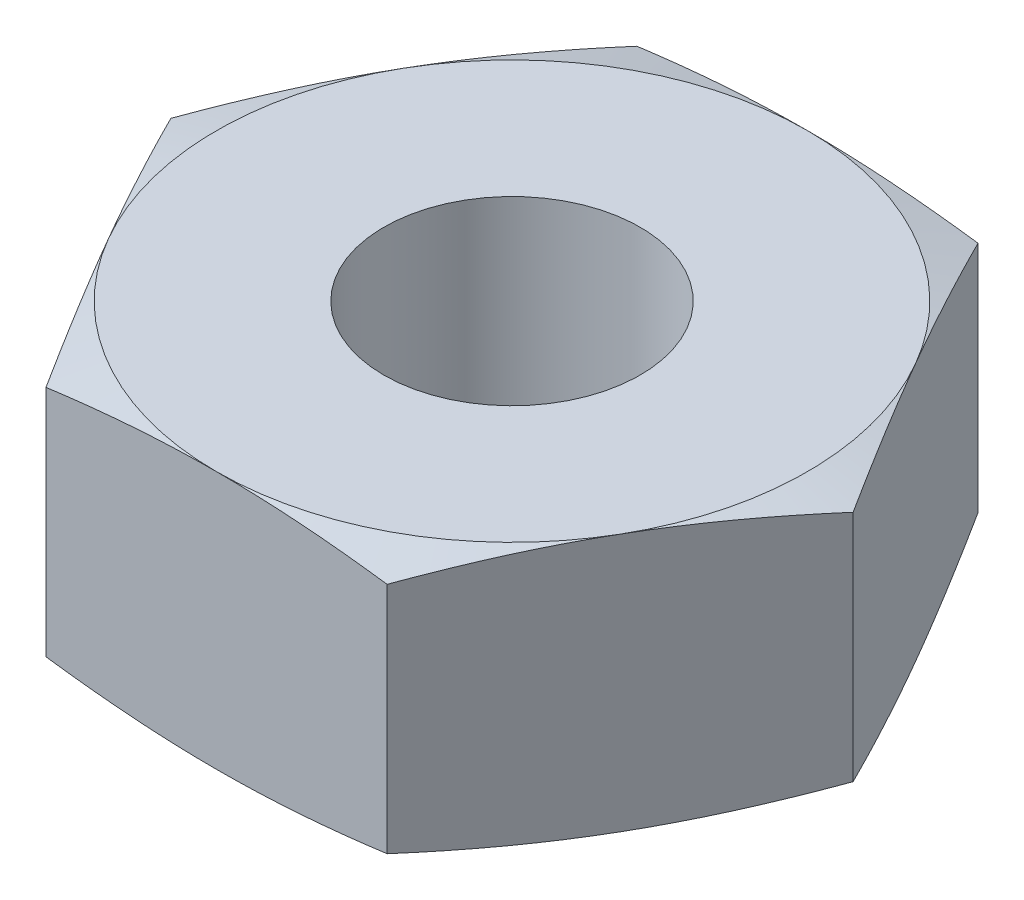
ISO-10303-21;
HEADER;
FILE_DESCRIPTION(('STEP AP214'),'2;1');
FILE_NAME('part.step','',(''),(''),'','','');
FILE_SCHEMA(('AUTOMOTIVE_DESIGN { 1 0 10303 214 1 1 1 1 }'));
ENDSEC;
DATA;
#1=APPLICATION_CONTEXT('core data for automotive mechanical design processes');
#2=APPLICATION_PROTOCOL_DEFINITION('international standard','automotive_design',2000,#1);
#3=PRODUCT_CONTEXT('',#1,'mechanical');
#4=PRODUCT('Part','Part','',(#3));
#5=PRODUCT_RELATED_PRODUCT_CATEGORY('part','',(#4));
#6=PRODUCT_DEFINITION_FORMATION('','',#4);
#7=PRODUCT_DEFINITION_CONTEXT('part definition',#1,'design');
#8=PRODUCT_DEFINITION('design','',#6,#7);
#9=PRODUCT_DEFINITION_SHAPE('','',#8);
#10=(LENGTH_UNIT() NAMED_UNIT(*) SI_UNIT(.MILLI.,.METRE.));
#11=(NAMED_UNIT(*) PLANE_ANGLE_UNIT() SI_UNIT($,.RADIAN.));
#12=(NAMED_UNIT(*) SI_UNIT($,.STERADIAN.) SOLID_ANGLE_UNIT());
#13=UNCERTAINTY_MEASURE_WITH_UNIT(LENGTH_MEASURE(1.E-05),#10,'distance_accuracy_value','');
#14=(GEOMETRIC_REPRESENTATION_CONTEXT(3) GLOBAL_UNCERTAINTY_ASSIGNED_CONTEXT((#13)) GLOBAL_UNIT_ASSIGNED_CONTEXT((#10,
#11,#12)) REPRESENTATION_CONTEXT('',''));
#15=CARTESIAN_POINT('',(0.,0.,0.));
#16=DIRECTION('',(0.,0.,1.));
#17=DIRECTION('',(1.,0.,0.));
#18=AXIS2_PLACEMENT_3D('',#15,#16,#17);
#19=CARTESIAN_POINT('',(1.58771324027147,1.2,2.75));
#20=DIRECTION('',(-0.866025403784439,0.,-0.5));
#21=DIRECTION('',(-0.5,0.,0.866025403784439));
#22=AXIS2_PLACEMENT_3D('',#19,#20,#21);
#23=PLANE('',#22);
#24=CARTESIAN_POINT('',(3.17554195059678,-1.08597637630444,-0.000200000000000029));
#25=CARTESIAN_POINT('',(3.10959865092347,-1.10365443906504,0.114017145452912));
#26=CARTESIAN_POINT('',(3.04353577722558,-1.11970328837943,0.228441399191655));
#27=CARTESIAN_POINT('',(2.91117669093731,-1.14789971485019,0.457694061486332));
#28=CARTESIAN_POINT('',(2.84488039456776,-1.1600457069014,0.572522615152036));
#29=CARTESIAN_POINT('',(2.71245647646233,-1.1797272517536,0.801887569447985));
#30=CARTESIAN_POINT('',(2.6463297504511,-1.18728627891702,0.916422418637631));
#31=CARTESIAN_POINT('',(2.51399195722482,-1.19742217092489,1.14563820026708));
#32=CARTESIAN_POINT('',(2.44778090881601,-1.19999999999999,1.26031910013354));
#33=CARTESIAN_POINT('',(2.3153588119984,-1.19999999999999,1.48968089986646));
#34=CARTESIAN_POINT('',(2.24914776358959,-1.19742217092489,1.60436179973292));
#35=CARTESIAN_POINT('',(2.11680997036331,-1.18728627891702,1.83357758136237));
#36=CARTESIAN_POINT('',(2.05068324435208,-1.1797272517536,1.94811243055202));
#37=CARTESIAN_POINT('',(1.91825932624665,-1.1600457069014,2.17747738484797));
#38=CARTESIAN_POINT('',(1.8519630298771,-1.14789971485019,2.29230593851367));
#39=CARTESIAN_POINT('',(1.71960394358883,-1.11970328837943,2.52155860080835));
#40=CARTESIAN_POINT('',(1.65354106989094,-1.10365443906503,2.63598285454709));
#41=CARTESIAN_POINT('',(1.58759777021763,-1.08597637630444,2.7502));
#42=B_SPLINE_CURVE_WITH_KNOTS('',3,(#24,#25,#26,#27,#28,#29,#30,#31,#32,#33,#34,#35,#36,#37,#38,
#39,#40,#41),.UNSPECIFIED.,.F.,.F.,(4,2,2,2,2,2,2,2,4),(0.,0.399219246203696,0.798600426844827,
1.19592009799431,1.59316285066086,1.99040560332741,2.38772527447689,2.78710645511802,
3.18632570132172),.UNSPECIFIED.);
#43=CARTESIAN_POINT('',(3.17542648054295,-1.0860073180997,0.));
#44=VERTEX_POINT('',#43);
#45=CARTESIAN_POINT('',(2.38156986040721,-1.2,1.375));
#46=VERTEX_POINT('',#45);
#47=EDGE_CURVE('E54',#44,#46,#42,.T.);
#48=ORIENTED_EDGE('',*,*,#47,.F.);
#49=DIRECTION('',(0.,-1.,0.));
#50=VECTOR('',#49,1.);
#51=CARTESIAN_POINT('',(3.17542648054294,1.2,0.));
#52=LINE('',#51,#50);
#53=CARTESIAN_POINT('',(3.17542648054295,1.0860073180997,0.));
#54=VERTEX_POINT('',#53);
#55=EDGE_CURVE('E172',#54,#44,#52,.T.);
#56=ORIENTED_EDGE('',*,*,#55,.F.);
#57=CARTESIAN_POINT('',(1.58759777021763,1.08597637630445,2.7502));
#58=CARTESIAN_POINT('',(1.65354106989094,1.10365443906503,2.63598285454709));
#59=CARTESIAN_POINT('',(1.71960394358883,1.11970328837943,2.52155860080835));
#60=CARTESIAN_POINT('',(1.8519630298771,1.14789971485019,2.29230593851367));
#61=CARTESIAN_POINT('',(1.91825932624665,1.1600457069014,2.17747738484796));
#62=CARTESIAN_POINT('',(2.05068324435208,1.1797272517536,1.94811243055202));
#63=CARTESIAN_POINT('',(2.11680997036331,1.18728627891702,1.83357758136237));
#64=CARTESIAN_POINT('',(2.24914776358959,1.19742217092489,1.60436179973292));
#65=CARTESIAN_POINT('',(2.3153588119984,1.19999999999999,1.48968089986646));
#66=CARTESIAN_POINT('',(2.44778090881601,1.19999999999999,1.26031910013354));
#67=CARTESIAN_POINT('',(2.51399195722482,1.19742217092489,1.14563820026708));
#68=CARTESIAN_POINT('',(2.6463297504511,1.18728627891702,0.91642241863763));
#69=CARTESIAN_POINT('',(2.71245647646233,1.1797272517536,0.801887569447984));
#70=CARTESIAN_POINT('',(2.84488039456776,1.1600457069014,0.572522615152035));
#71=CARTESIAN_POINT('',(2.91117669093731,1.14789971485019,0.457694061486332));
#72=CARTESIAN_POINT('',(3.04353577722558,1.11970328837943,0.228441399191655));
#73=CARTESIAN_POINT('',(3.10959865092347,1.10365443906503,0.114017145452912));
#74=CARTESIAN_POINT('',(3.17554195059678,1.08597637630444,-0.00020000000000015));
#75=B_SPLINE_CURVE_WITH_KNOTS('',3,(#57,#58,#59,#60,#61,#62,#63,#64,#65,#66,#67,#68,#69,#70,#71,
#72,#73,#74),.UNSPECIFIED.,.F.,.F.,(4,2,2,2,2,2,2,2,4),(0.,0.399219246203696,0.798600426844827,
1.19592009799431,1.59316285066086,1.99040560332741,2.38772527447689,2.78710645511802,
3.18632570132172),.UNSPECIFIED.);
#76=CARTESIAN_POINT('',(2.38156986040721,1.2,1.375));
#77=VERTEX_POINT('',#76);
#78=EDGE_CURVE('E264',#77,#54,#75,.T.);
#79=ORIENTED_EDGE('',*,*,#78,.F.);
#80=CARTESIAN_POINT('',(1.58771324027148,1.0860073180997,2.75));
#81=VERTEX_POINT('',#80);
#82=EDGE_CURVE('E162',#81,#77,#75,.T.);
#83=ORIENTED_EDGE('',*,*,#82,.F.);
#84=DIRECTION('',(0.,-1.,0.));
#85=VECTOR('',#84,1.);
#86=CARTESIAN_POINT('',(1.58771324027147,1.2,2.75));
#87=LINE('',#86,#85);
#88=CARTESIAN_POINT('',(1.58771324027148,-1.0860073180997,2.75));
#89=VERTEX_POINT('',#88);
#90=EDGE_CURVE('E157',#81,#89,#87,.T.);
#91=ORIENTED_EDGE('',*,*,#90,.T.);
#92=EDGE_CURVE('E149',#46,#89,#42,.T.);
#93=ORIENTED_EDGE('',*,*,#92,.F.);
#94=EDGE_LOOP('',(#48,#56,#79,#83,#91,#93));
#95=FACE_BOUND('',#94,.T.);
#96=ADVANCED_FACE('F38',(#95),#23,.F.);
#97=CARTESIAN_POINT('',(3.17542648054294,1.2,0.));
#98=DIRECTION('',(-0.866025403784439,0.,0.5));
#99=DIRECTION('',(0.5,0.,0.866025403784439));
#100=AXIS2_PLACEMENT_3D('',#97,#98,#99);
#101=PLANE('',#100);
#102=CARTESIAN_POINT('',(1.58759777021763,-1.08597637630445,-2.7502));
#103=CARTESIAN_POINT('',(1.65354106989094,-1.10365443906503,-2.63598285454709));
#104=CARTESIAN_POINT('',(1.71960394358883,-1.11970328837943,-2.52155860080835));
#105=CARTESIAN_POINT('',(1.8519630298771,-1.14789971485019,-2.29230593851367));
#106=CARTESIAN_POINT('',(1.91825932624665,-1.1600457069014,-2.17747738484797));
#107=CARTESIAN_POINT('',(2.05068324435208,-1.1797272517536,-1.94811243055202));
#108=CARTESIAN_POINT('',(2.11680997036331,-1.18728627891702,-1.83357758136237));
#109=CARTESIAN_POINT('',(2.24914776358959,-1.19742217092489,-1.60436179973292));
#110=CARTESIAN_POINT('',(2.3153588119984,-1.19999999999999,-1.48968089986646));
#111=CARTESIAN_POINT('',(2.44778090881601,-1.19999999999999,-1.26031910013354));
#112=CARTESIAN_POINT('',(2.51399195722482,-1.19742217092489,-1.14563820026708));
#113=CARTESIAN_POINT('',(2.6463297504511,-1.18728627891702,-0.916422418637631));
#114=CARTESIAN_POINT('',(2.71245647646233,-1.1797272517536,-0.801887569447985));
#115=CARTESIAN_POINT('',(2.84488039456776,-1.1600457069014,-0.572522615152036));
#116=CARTESIAN_POINT('',(2.91117669093731,-1.14789971485019,-0.457694061486332));
#117=CARTESIAN_POINT('',(3.04353577722558,-1.11970328837943,-0.228441399191655));
#118=CARTESIAN_POINT('',(3.10959865092347,-1.10365443906503,-0.114017145452912));
#119=CARTESIAN_POINT('',(3.17554195059678,-1.08597637630444,0.000199999999999699));
#120=B_SPLINE_CURVE_WITH_KNOTS('',3,(#102,#103,#104,#105,#106,#107,#108,#109,#110,#111,#112,
#113,#114,#115,#116,#117,#118,#119),.UNSPECIFIED.,.F.,.F.,(4,2,2,2,2,2,2,2,4),(0.,
0.399219246203696,0.798600426844827,1.19592009799431,1.59316285066086,1.99040560332741,
2.38772527447689,2.78710645511802,3.18632570132172),.UNSPECIFIED.);
#121=CARTESIAN_POINT('',(1.58771324027146,-1.0860073180997,-2.75000000000001));
#122=VERTEX_POINT('',#121);
#123=CARTESIAN_POINT('',(2.38156986040721,-1.2,-1.375));
#124=VERTEX_POINT('',#123);
#125=EDGE_CURVE('E61',#122,#124,#120,.T.);
#126=ORIENTED_EDGE('',*,*,#125,.F.);
#127=DIRECTION('',(0.,-1.,0.));
#128=VECTOR('',#127,1.);
#129=CARTESIAN_POINT('',(1.58771324027147,1.2,-2.75));
#130=LINE('',#129,#128);
#131=CARTESIAN_POINT('',(1.58771324027148,1.0860073180997,-2.75));
#132=VERTEX_POINT('',#131);
#133=EDGE_CURVE('E168',#132,#122,#130,.T.);
#134=ORIENTED_EDGE('',*,*,#133,.F.);
#135=CARTESIAN_POINT('',(3.17554195059678,1.08597637630444,0.000199999999999324));
#136=CARTESIAN_POINT('',(3.10959865092347,1.10365443906503,-0.114017145452913));
#137=CARTESIAN_POINT('',(3.04353577722558,1.11970328837943,-0.228441399191655));
#138=CARTESIAN_POINT('',(2.91117669093731,1.14789971485019,-0.457694061486333));
#139=CARTESIAN_POINT('',(2.84488039456776,1.1600457069014,-0.572522615152036));
#140=CARTESIAN_POINT('',(2.71245647646233,1.1797272517536,-0.801887569447985));
#141=CARTESIAN_POINT('',(2.6463297504511,1.18728627891702,-0.916422418637631));
#142=CARTESIAN_POINT('',(2.51399195722482,1.19742217092489,-1.14563820026708));
#143=CARTESIAN_POINT('',(2.44778090881601,1.19999999999999,-1.26031910013354));
#144=CARTESIAN_POINT('',(2.3153588119984,1.19999999999999,-1.48968089986646));
#145=CARTESIAN_POINT('',(2.24914776358959,1.19742217092489,-1.60436179973292));
#146=CARTESIAN_POINT('',(2.11680997036331,1.18728627891702,-1.83357758136237));
#147=CARTESIAN_POINT('',(2.05068324435208,1.1797272517536,-1.94811243055202));
#148=CARTESIAN_POINT('',(1.91825932624665,1.1600457069014,-2.17747738484797));
#149=CARTESIAN_POINT('',(1.8519630298771,1.14789971485019,-2.29230593851367));
#150=CARTESIAN_POINT('',(1.71960394358883,1.11970328837943,-2.52155860080835));
#151=CARTESIAN_POINT('',(1.65354106989094,1.10365443906503,-2.63598285454709));
#152=CARTESIAN_POINT('',(1.58759777021763,1.08597637630444,-2.7502));
#153=B_SPLINE_CURVE_WITH_KNOTS('',3,(#135,#136,#137,#138,#139,#140,#141,#142,#143,#144,#145,
#146,#147,#148,#149,#150,#151,#152),.UNSPECIFIED.,.F.,.F.,(4,2,2,2,2,2,2,2,4),(0.,
0.399219246203696,0.798600426844827,1.19592009799431,1.59316285066086,1.99040560332741,
2.38772527447689,2.78710645511802,3.18632570132172),.UNSPECIFIED.);
#154=CARTESIAN_POINT('',(2.38156986040721,1.2,-1.375));
#155=VERTEX_POINT('',#154);
#156=EDGE_CURVE('E258',#155,#132,#153,.T.);
#157=ORIENTED_EDGE('',*,*,#156,.F.);
#158=EDGE_CURVE('E262',#54,#155,#153,.T.);
#159=ORIENTED_EDGE('',*,*,#158,.F.);
#160=ORIENTED_EDGE('',*,*,#55,.T.);
#161=EDGE_CURVE('E276',#124,#44,#120,.T.);
#162=ORIENTED_EDGE('',*,*,#161,.F.);
#163=EDGE_LOOP('',(#126,#134,#157,#159,#160,#162));
#164=FACE_BOUND('',#163,.T.);
#165=ADVANCED_FACE('F268',(#164),#101,.F.);
#166=CARTESIAN_POINT('',(1.58771324027147,1.2,-2.75));
#167=DIRECTION('',(0.,0.,1.));
#168=DIRECTION('',(1.,0.,0.));
#169=AXIS2_PLACEMENT_3D('',#166,#167,#168);
#170=PLANE('',#169);
#171=CARTESIAN_POINT('',(-4.27636085043983,-0.574535274427041,-2.75));
#172=CARTESIAN_POINT('',(-4.15064869310771,-0.602860126130478,-2.75));
#173=CARTESIAN_POINT('',(-4.02485999707096,-0.630850457396701,-2.75));
#174=CARTESIAN_POINT('',(-3.77309163921182,-0.685982573720404,-2.75));
#175=CARTESIAN_POINT('',(-3.64711196983412,-0.713124324236215,-2.75));
#176=CARTESIAN_POINT('',(-3.39482501692458,-0.766400454095589,-2.75));
#177=CARTESIAN_POINT('',(-3.26851754434713,-0.792533942518524,-2.75));
#178=CARTESIAN_POINT('',(-3.01564537804616,-0.843518803311811,-2.75));
#179=CARTESIAN_POINT('',(-2.88908068636279,-0.868370185810373,-2.75));
#180=CARTESIAN_POINT('',(-2.51119982672915,-0.94014042557273,-2.75));
#181=CARTESIAN_POINT('',(-2.259439179107,-0.984762145313864,-2.75));
#182=CARTESIAN_POINT('',(-1.75437363109257,-1.06452753951379,-2.75));
#183=CARTESIAN_POINT('',(-1.5010688760915,-1.0996720926535,-2.75));
#184=CARTESIAN_POINT('',(-1.11844193079639,-1.14200549702533,-2.75));
#185=CARTESIAN_POINT('',(-0.989701627895131,-1.15442718932931,-2.75));
#186=CARTESIAN_POINT('',(-0.73188837604658,-1.17506258003211,-2.75));
#187=CARTESIAN_POINT('',(-0.602815456837377,-1.18327664234063,-2.75));
#188=CARTESIAN_POINT('',(-0.344521177221319,-1.19502221761625,-2.75));
#189=CARTESIAN_POINT('',(-0.215299931660418,-1.19855620864307,-2.75));
#190=CARTESIAN_POINT('',(0.0431842262815525,-1.20072236088508,-2.75));
#191=CARTESIAN_POINT('',(0.172447138542314,-1.19935453612906,-2.75));
#192=CARTESIAN_POINT('',(0.431421027849017,-1.19178940324801,-2.75));
#193=CARTESIAN_POINT('',(0.561131346311024,-1.18557000969012,-2.75));
#194=CARTESIAN_POINT('',(0.820261259095127,-1.16865782117221,-2.75));
#195=CARTESIAN_POINT('',(0.949680837577812,-1.15796478816002,-2.75));
#196=CARTESIAN_POINT('',(1.20822752304289,-1.13266422024831,-2.75));
#197=CARTESIAN_POINT('',(1.33735434228499,-1.11805379091975,-2.75));
#198=CARTESIAN_POINT('',(1.59518795631852,-1.08554986868654,-2.75));
#199=CARTESIAN_POINT('',(1.72389475301019,-1.06765639065592,-2.75));
#200=CARTESIAN_POINT('',(2.00976923057656,-1.02486366878538,-2.75));
#201=CARTESIAN_POINT('',(2.1668357454543,-0.999293599047255,-2.75));
#202=CARTESIAN_POINT('',(2.48043642831434,-0.945059945227124,-2.75));
#203=CARTESIAN_POINT('',(2.63697056495118,-0.916396182138713,-2.75));
#204=CARTESIAN_POINT('',(2.94961659006402,-0.856699157573873,-2.75));
#205=CARTESIAN_POINT('',(3.10572838580151,-0.825665413497669,-2.75));
#206=CARTESIAN_POINT('',(3.4175804322032,-0.761778633970489,-2.75));
#207=CARTESIAN_POINT('',(3.57332067537021,-0.728925562127603,-2.75));
#208=CARTESIAN_POINT('',(4.04027781605472,-0.628239216302156,-2.75));
#209=CARTESIAN_POINT('',(4.35104289966404,-0.558315887309779,-2.75));
#210=CARTESIAN_POINT('',(4.97173435648208,-0.415058253392503,-2.75));
#211=CARTESIAN_POINT('',(5.28166083184902,-0.341724385743333,-2.75));
#212=CARTESIAN_POINT('',(5.89619777668217,-0.193963061621825,-2.75));
#213=CARTESIAN_POINT('',(6.20081651406682,-0.119569914597573,-2.75));
#214=CARTESIAN_POINT('',(6.80969786964483,0.0307062456877314,-2.75));
#215=CARTESIAN_POINT('',(7.11396047331712,0.106589317600791,-2.75));
#216=CARTESIAN_POINT('',(7.72162480619849,0.25925766485698,-2.75));
#217=CARTESIAN_POINT('',(8.02502705380527,0.336040880148408,-2.75));
#218=CARTESIAN_POINT('',(8.63161623647014,0.490389456843218,-2.75));
#219=CARTESIAN_POINT('',(8.9348031816875,0.567954778296711,-2.75));
#220=CARTESIAN_POINT('',(9.23792207783451,0.645782218683325,-2.75));
#221=B_SPLINE_CURVE_WITH_KNOTS('',3,(#171,#172,#173,#174,#175,#176,#177,#178,#179,#180,#181,
#182,#183,#184,#185,#186,#187,#188,#189,#190,#191,#192,#193,#194,#195,#196,#197,#198,#199,#200,
#201,#202,#203,#204,#205,#206,#207,#208,#209,#210,#211,#212,#213,#214,#215,#216,#217,#218,#219,
#220),.UNSPECIFIED.,.F.,.F.,(4,2,2,2,2,2,2,2,2,2,2,2,2,2,2,2,2,2,2,2,2,2,2,2,4),(0.,
0.386592162363836,0.773200040614211,1.16014205468213,1.54708101156903,2.31403183337596,
3.08091152243168,3.46886888912461,3.85679269647433,4.24451101908412,4.6322282320609,
5.02172079475262,5.41123408583486,5.80103597174549,6.19083609168133,6.66819654644838,
7.14558463693252,7.62307019860843,8.10056531485361,9.05613097273136,10.0115744505277,
10.9522823572973,11.8930273702795,12.8319283500748,13.7707816114541),.UNSPECIFIED.);
#222=CARTESIAN_POINT('',(-1.58771324027146,-1.0860073180997,-2.75000000000001));
#223=VERTEX_POINT('',#222);
#224=CARTESIAN_POINT('',(0.,-1.2,-2.75));
#225=VERTEX_POINT('',#224);
#226=EDGE_CURVE('E291',#223,#225,#221,.T.);
#227=ORIENTED_EDGE('',*,*,#226,.F.);
#228=DIRECTION('',(0.,-1.,0.));
#229=VECTOR('',#228,1.);
#230=CARTESIAN_POINT('',(-1.58771324027147,1.2,-2.75));
#231=LINE('',#230,#229);
#232=CARTESIAN_POINT('',(-1.58771324027146,1.0860073180997,-2.75000000000001));
#233=VERTEX_POINT('',#232);
#234=EDGE_CURVE('E159',#233,#223,#231,.T.);
#235=ORIENTED_EDGE('',*,*,#234,.F.);
#236=CARTESIAN_POINT('',(-4.27636085043983,0.57453527442704,-2.75));
#237=CARTESIAN_POINT('',(-4.15064869310772,0.602860126130479,-2.75));
#238=CARTESIAN_POINT('',(-4.02485999707096,0.630850457396702,-2.75));
#239=CARTESIAN_POINT('',(-3.77309163921183,0.685982573720404,-2.75));
#240=CARTESIAN_POINT('',(-3.64711196983412,0.713124324236213,-2.75));
#241=CARTESIAN_POINT('',(-3.39482501692458,0.766400454095587,-2.75));
#242=CARTESIAN_POINT('',(-3.26851754434713,0.792533942518522,-2.75));
#243=CARTESIAN_POINT('',(-3.01564537804616,0.843518803311811,-2.75));
#244=CARTESIAN_POINT('',(-2.88908068636279,0.868370185810373,-2.75));
#245=CARTESIAN_POINT('',(-2.51119982672915,0.940140425572731,-2.75));
#246=CARTESIAN_POINT('',(-2.259439179107,0.984762145313865,-2.75));
#247=CARTESIAN_POINT('',(-1.75437363109257,1.06452753951379,-2.75));
#248=CARTESIAN_POINT('',(-1.5010688760915,1.0996720926535,-2.75));
#249=CARTESIAN_POINT('',(-1.11844193079639,1.14200549702532,-2.75));
#250=CARTESIAN_POINT('',(-0.989701627895131,1.15442718932931,-2.75));
#251=CARTESIAN_POINT('',(-0.73188837604658,1.17506258003211,-2.75));
#252=CARTESIAN_POINT('',(-0.602815456837377,1.18327664234063,-2.75));
#253=CARTESIAN_POINT('',(-0.344521177221319,1.19502221761625,-2.75));
#254=CARTESIAN_POINT('',(-0.215299931660418,1.19855620864308,-2.75));
#255=CARTESIAN_POINT('',(0.0431842262815522,1.20072236088509,-2.75));
#256=CARTESIAN_POINT('',(0.172447138542314,1.19935453612906,-2.75));
#257=CARTESIAN_POINT('',(0.431421027849017,1.19178940324801,-2.75));
#258=CARTESIAN_POINT('',(0.561131346311025,1.18557000969012,-2.75));
#259=CARTESIAN_POINT('',(0.820261259095127,1.16865782117221,-2.75));
#260=CARTESIAN_POINT('',(0.949680837577812,1.15796478816002,-2.75));
#261=CARTESIAN_POINT('',(1.20822752304289,1.13266422024831,-2.75));
#262=CARTESIAN_POINT('',(1.33735434228499,1.11805379091974,-2.75));
#263=CARTESIAN_POINT('',(1.59518795631852,1.08554986868654,-2.75));
#264=CARTESIAN_POINT('',(1.72389475301019,1.06765639065592,-2.75));
#265=CARTESIAN_POINT('',(2.00976923057656,1.02486366878538,-2.75));
#266=CARTESIAN_POINT('',(2.1668357454543,0.999293599047253,-2.75));
#267=CARTESIAN_POINT('',(2.48043642831434,0.945059945227124,-2.75));
#268=CARTESIAN_POINT('',(2.63697056495118,0.916396182138718,-2.75));
#269=CARTESIAN_POINT('',(2.94961659006402,0.85669915757388,-2.75));
#270=CARTESIAN_POINT('',(3.10572838580151,0.82566541349767,-2.75));
#271=CARTESIAN_POINT('',(3.4175804322032,0.761778633970488,-2.75));
#272=CARTESIAN_POINT('',(3.57332067537021,0.728925562127605,-2.75));
#273=CARTESIAN_POINT('',(4.04027781605472,0.628239216302161,-2.75));
#274=CARTESIAN_POINT('',(4.35104289966404,0.558315887309779,-2.75));
#275=CARTESIAN_POINT('',(4.97173435648208,0.415058253392501,-2.75));
#276=CARTESIAN_POINT('',(5.28166083184902,0.341724385743334,-2.75));
#277=CARTESIAN_POINT('',(5.89619777668217,0.193963061621828,-2.75));
#278=CARTESIAN_POINT('',(6.20081651406682,0.119569914597574,-2.75));
#279=CARTESIAN_POINT('',(6.80969786964483,-0.0307062456877316,-2.75));
#280=CARTESIAN_POINT('',(7.11396047331712,-0.106589317600792,-2.75));
#281=CARTESIAN_POINT('',(7.72162480619849,-0.259257664856981,-2.75));
#282=CARTESIAN_POINT('',(8.02502705380527,-0.33604088014841,-2.75));
#283=CARTESIAN_POINT('',(8.63161623647014,-0.49038945684322,-2.75));
#284=CARTESIAN_POINT('',(8.9348031816875,-0.567954778296713,-2.75));
#285=CARTESIAN_POINT('',(9.23792207783451,-0.645782218683328,-2.75));
#286=B_SPLINE_CURVE_WITH_KNOTS('',3,(#236,#237,#238,#239,#240,#241,#242,#243,#244,#245,#246,
#247,#248,#249,#250,#251,#252,#253,#254,#255,#256,#257,#258,#259,#260,#261,#262,#263,#264,#265,
#266,#267,#268,#269,#270,#271,#272,#273,#274,#275,#276,#277,#278,#279,#280,#281,#282,#283,#284,
#285),.UNSPECIFIED.,.F.,.F.,(4,2,2,2,2,2,2,2,2,2,2,2,2,2,2,2,2,2,2,2,2,2,2,2,4),(0.,
0.386592162363837,0.773200040614211,1.16014205468213,1.54708101156903,2.31403183337596,
3.08091152243168,3.46886888912461,3.85679269647433,4.24451101908412,4.6322282320609,
5.02172079475262,5.41123408583487,5.80103597174549,6.19083609168133,6.66819654644838,
7.14558463693252,7.62307019860843,8.10056531485361,9.05613097273136,10.0115744505277,
10.9522823572973,11.8930273702795,12.8319283500748,13.7707816114541),.UNSPECIFIED.);
#287=CARTESIAN_POINT('',(0.,1.2,-2.75));
#288=VERTEX_POINT('',#287);
#289=EDGE_CURVE('E215',#288,#233,#286,.F.);
#290=ORIENTED_EDGE('',*,*,#289,.F.);
#291=EDGE_CURVE('E263',#132,#288,#286,.F.);
#292=ORIENTED_EDGE('',*,*,#291,.F.);
#293=ORIENTED_EDGE('',*,*,#133,.T.);
#294=EDGE_CURVE('E287',#225,#122,#221,.T.);
#295=ORIENTED_EDGE('',*,*,#294,.F.);
#296=EDGE_LOOP('',(#227,#235,#290,#292,#293,#295));
#297=FACE_BOUND('',#296,.T.);
#298=ADVANCED_FACE('F271',(#297),#170,.F.);
#299=CARTESIAN_POINT('',(-1.58771324027147,1.2,-2.75));
#300=DIRECTION('',(0.866025403784439,0.,0.5));
#301=DIRECTION('',(0.5,0.,-0.866025403784439));
#302=AXIS2_PLACEMENT_3D('',#299,#300,#301);
#303=PLANE('',#302);
#304=CARTESIAN_POINT('',(-3.17554195059678,-1.08597637630444,0.000199999999999179));
#305=CARTESIAN_POINT('',(-3.10959865092347,-1.10365443906503,-0.114017145452913));
#306=CARTESIAN_POINT('',(-3.04353577722559,-1.11970328837943,-0.228441399191656));
#307=CARTESIAN_POINT('',(-2.91117669093731,-1.14789971485019,-0.457694061486333));
#308=CARTESIAN_POINT('',(-2.84488039456777,-1.1600457069014,-0.572522615152036));
#309=CARTESIAN_POINT('',(-2.71245647646233,-1.1797272517536,-0.801887569447985));
#310=CARTESIAN_POINT('',(-2.6463297504511,-1.18728627891702,-0.916422418637632));
#311=CARTESIAN_POINT('',(-2.51399195722482,-1.19742217092489,-1.14563820026708));
#312=CARTESIAN_POINT('',(-2.44778090881602,-1.19999999999999,-1.26031910013354));
#313=CARTESIAN_POINT('',(-2.3153588119984,-1.19999999999999,-1.48968089986646));
#314=CARTESIAN_POINT('',(-2.24914776358959,-1.19742217092489,-1.60436179973292));
#315=CARTESIAN_POINT('',(-2.11680997036331,-1.18728627891702,-1.83357758136237));
#316=CARTESIAN_POINT('',(-2.05068324435208,-1.1797272517536,-1.94811243055202));
#317=CARTESIAN_POINT('',(-1.91825932624665,-1.1600457069014,-2.17747738484797));
#318=CARTESIAN_POINT('',(-1.8519630298771,-1.14789971485019,-2.29230593851367));
#319=CARTESIAN_POINT('',(-1.71960394358883,-1.11970328837943,-2.52155860080835));
#320=CARTESIAN_POINT('',(-1.65354106989094,-1.10365443906503,-2.63598285454709));
#321=CARTESIAN_POINT('',(-1.58759777021763,-1.08597637630444,-2.7502));
#322=B_SPLINE_CURVE_WITH_KNOTS('',3,(#304,#305,#306,#307,#308,#309,#310,#311,#312,#313,#314,
#315,#316,#317,#318,#319,#320,#321),.UNSPECIFIED.,.F.,.F.,(4,2,2,2,2,2,2,2,4),(0.,
0.399219246203696,0.798600426844827,1.19592009799431,1.59316285066086,1.99040560332741,
2.38772527447689,2.78710645511802,3.18632570132172),.UNSPECIFIED.);
#323=CARTESIAN_POINT('',(-3.17542648054295,-1.0860073180997,0.));
#324=VERTEX_POINT('',#323);
#325=CARTESIAN_POINT('',(-2.38156986040721,-1.2,-1.375));
#326=VERTEX_POINT('',#325);
#327=EDGE_CURVE('E282',#324,#326,#322,.T.);
#328=ORIENTED_EDGE('',*,*,#327,.F.);
#329=DIRECTION('',(0.,-1.,0.));
#330=VECTOR('',#329,1.);
#331=CARTESIAN_POINT('',(-3.17542648054294,1.2,0.));
#332=LINE('',#331,#330);
#333=CARTESIAN_POINT('',(-3.17542648054295,1.0860073180997,0.));
#334=VERTEX_POINT('',#333);
#335=EDGE_CURVE('E156',#334,#324,#332,.T.);
#336=ORIENTED_EDGE('',*,*,#335,.F.);
#337=CARTESIAN_POINT('',(-1.58759777021763,1.08597637630445,-2.7502));
#338=CARTESIAN_POINT('',(-1.65354106989094,1.10365443906504,-2.63598285454709));
#339=CARTESIAN_POINT('',(-1.71960394358883,1.11970328837943,-2.52155860080835));
#340=CARTESIAN_POINT('',(-1.8519630298771,1.14789971485018,-2.29230593851367));
#341=CARTESIAN_POINT('',(-1.91825932624665,1.1600457069014,-2.17747738484797));
#342=CARTESIAN_POINT('',(-2.05068324435208,1.1797272517536,-1.94811243055202));
#343=CARTESIAN_POINT('',(-2.11680997036331,1.18728627891702,-1.83357758136237));
#344=CARTESIAN_POINT('',(-2.24914776358959,1.19742217092489,-1.60436179973292));
#345=CARTESIAN_POINT('',(-2.3153588119984,1.19999999999999,-1.48968089986646));
#346=CARTESIAN_POINT('',(-2.44778090881602,1.19999999999999,-1.26031910013354));
#347=CARTESIAN_POINT('',(-2.51399195722482,1.19742217092489,-1.14563820026708));
#348=CARTESIAN_POINT('',(-2.6463297504511,1.18728627891702,-0.916422418637631));
#349=CARTESIAN_POINT('',(-2.71245647646233,1.1797272517536,-0.801887569447985));
#350=CARTESIAN_POINT('',(-2.84488039456777,1.1600457069014,-0.572522615152036));
#351=CARTESIAN_POINT('',(-2.91117669093731,1.14789971485019,-0.457694061486333));
#352=CARTESIAN_POINT('',(-3.04353577722558,1.11970328837943,-0.228441399191656));
#353=CARTESIAN_POINT('',(-3.10959865092347,1.10365443906503,-0.114017145452912));
#354=CARTESIAN_POINT('',(-3.17554195059678,1.08597637630444,0.000199999999999145));
#355=B_SPLINE_CURVE_WITH_KNOTS('',3,(#337,#338,#339,#340,#341,#342,#343,#344,#345,#346,#347,
#348,#349,#350,#351,#352,#353,#354),.UNSPECIFIED.,.F.,.F.,(4,2,2,2,2,2,2,2,4),(0.,
0.399219246203696,0.798600426844827,1.19592009799431,1.59316285066086,1.99040560332741,
2.38772527447689,2.78710645511802,3.18632570132172),.UNSPECIFIED.);
#356=CARTESIAN_POINT('',(-2.38156986040721,1.2,-1.375));
#357=VERTEX_POINT('',#356);
#358=EDGE_CURVE('E206',#357,#334,#355,.T.);
#359=ORIENTED_EDGE('',*,*,#358,.F.);
#360=EDGE_CURVE('E209',#233,#357,#355,.T.);
#361=ORIENTED_EDGE('',*,*,#360,.F.);
#362=ORIENTED_EDGE('',*,*,#234,.T.);
#363=EDGE_CURVE('E292',#326,#223,#322,.T.);
#364=ORIENTED_EDGE('',*,*,#363,.F.);
#365=EDGE_LOOP('',(#328,#336,#359,#361,#362,#364));
#366=FACE_BOUND('',#365,.T.);
#367=ADVANCED_FACE('F208',(#366),#303,.F.);
#368=CARTESIAN_POINT('',(-3.17542648054294,1.2,0.));
#369=DIRECTION('',(0.866025403784439,0.,-0.5));
#370=DIRECTION('',(-0.5,0.,-0.866025403784439));
#371=AXIS2_PLACEMENT_3D('',#368,#369,#370);
#372=PLANE('',#371);
#373=CARTESIAN_POINT('',(-1.58759777021763,-1.08597637630445,2.7502));
#374=CARTESIAN_POINT('',(-1.65354106989094,-1.10365443906503,2.63598285454709));
#375=CARTESIAN_POINT('',(-1.71960394358883,-1.11970328837943,2.52155860080835));
#376=CARTESIAN_POINT('',(-1.8519630298771,-1.14789971485019,2.29230593851367));
#377=CARTESIAN_POINT('',(-1.91825932624665,-1.1600457069014,2.17747738484796));
#378=CARTESIAN_POINT('',(-2.05068324435208,-1.1797272517536,1.94811243055202));
#379=CARTESIAN_POINT('',(-2.11680997036331,-1.18728627891702,1.83357758136237));
#380=CARTESIAN_POINT('',(-2.24914776358959,-1.19742217092489,1.60436179973292));
#381=CARTESIAN_POINT('',(-2.3153588119984,-1.19999999999999,1.48968089986646));
#382=CARTESIAN_POINT('',(-2.44778090881602,-1.19999999999999,1.26031910013354));
#383=CARTESIAN_POINT('',(-2.51399195722482,-1.19742217092489,1.14563820026708));
#384=CARTESIAN_POINT('',(-2.6463297504511,-1.18728627891702,0.91642241863763));
#385=CARTESIAN_POINT('',(-2.71245647646233,-1.1797272517536,0.801887569447984));
#386=CARTESIAN_POINT('',(-2.84488039456777,-1.1600457069014,0.572522615152035));
#387=CARTESIAN_POINT('',(-2.91117669093731,-1.14789971485019,0.457694061486332));
#388=CARTESIAN_POINT('',(-3.04353577722558,-1.11970328837943,0.228441399191655));
#389=CARTESIAN_POINT('',(-3.10959865092347,-1.10365443906503,0.114017145452912));
#390=CARTESIAN_POINT('',(-3.17554195059678,-1.08597637630444,-0.000199999999999862));
#391=B_SPLINE_CURVE_WITH_KNOTS('',3,(#373,#374,#375,#376,#377,#378,#379,#380,#381,#382,#383,
#384,#385,#386,#387,#388,#389,#390),.UNSPECIFIED.,.F.,.F.,(4,2,2,2,2,2,2,2,4),(0.,
0.399219246203696,0.798600426844826,1.19592009799431,1.59316285066086,1.99040560332741,
2.38772527447689,2.78710645511802,3.18632570132172),.UNSPECIFIED.);
#392=CARTESIAN_POINT('',(-1.58771324027148,-1.0860073180997,2.75));
#393=VERTEX_POINT('',#392);
#394=CARTESIAN_POINT('',(-2.38156986040721,-1.2,1.375));
#395=VERTEX_POINT('',#394);
#396=EDGE_CURVE('E132',#393,#395,#391,.T.);
#397=ORIENTED_EDGE('',*,*,#396,.F.);
#398=DIRECTION('',(0.,-1.,0.));
#399=VECTOR('',#398,1.);
#400=CARTESIAN_POINT('',(-1.58771324027147,1.2,2.75));
#401=LINE('',#400,#399);
#402=CARTESIAN_POINT('',(-1.58771324027148,1.0860073180997,2.75));
#403=VERTEX_POINT('',#402);
#404=EDGE_CURVE('E146',#403,#393,#401,.T.);
#405=ORIENTED_EDGE('',*,*,#404,.F.);
#406=CARTESIAN_POINT('',(-3.17554195059678,1.08597637630444,-0.00020000000000006));
#407=CARTESIAN_POINT('',(-3.10959865092347,1.10365443906503,0.114017145452912));
#408=CARTESIAN_POINT('',(-3.04353577722558,1.11970328837943,0.228441399191655));
#409=CARTESIAN_POINT('',(-2.91117669093731,1.14789971485019,0.457694061486332));
#410=CARTESIAN_POINT('',(-2.84488039456777,1.1600457069014,0.572522615152035));
#411=CARTESIAN_POINT('',(-2.71245647646233,1.1797272517536,0.801887569447984));
#412=CARTESIAN_POINT('',(-2.6463297504511,1.18728627891702,0.91642241863763));
#413=CARTESIAN_POINT('',(-2.51399195722482,1.19742217092489,1.14563820026708));
#414=CARTESIAN_POINT('',(-2.44778090881602,1.19999999999999,1.26031910013354));
#415=CARTESIAN_POINT('',(-2.3153588119984,1.19999999999999,1.48968089986646));
#416=CARTESIAN_POINT('',(-2.24914776358959,1.19742217092489,1.60436179973292));
#417=CARTESIAN_POINT('',(-2.11680997036331,1.18728627891702,1.83357758136237));
#418=CARTESIAN_POINT('',(-2.05068324435208,1.1797272517536,1.94811243055202));
#419=CARTESIAN_POINT('',(-1.91825932624665,1.1600457069014,2.17747738484796));
#420=CARTESIAN_POINT('',(-1.8519630298771,1.14789971485019,2.29230593851367));
#421=CARTESIAN_POINT('',(-1.71960394358883,1.11970328837943,2.52155860080834));
#422=CARTESIAN_POINT('',(-1.65354106989094,1.10365443906503,2.63598285454709));
#423=CARTESIAN_POINT('',(-1.58759777021763,1.08597637630444,2.7502));
#424=B_SPLINE_CURVE_WITH_KNOTS('',3,(#406,#407,#408,#409,#410,#411,#412,#413,#414,#415,#416,
#417,#418,#419,#420,#421,#422,#423),.UNSPECIFIED.,.F.,.F.,(4,2,2,2,2,2,2,2,4),(0.,
0.399219246203696,0.798600426844827,1.19592009799431,1.59316285066086,1.99040560332741,
2.38772527447689,2.78710645511802,3.18632570132172),.UNSPECIFIED.);
#425=CARTESIAN_POINT('',(-2.38156986040721,1.2,1.375));
#426=VERTEX_POINT('',#425);
#427=EDGE_CURVE('E216',#426,#403,#424,.T.);
#428=ORIENTED_EDGE('',*,*,#427,.F.);
#429=EDGE_CURVE('E213',#334,#426,#424,.T.);
#430=ORIENTED_EDGE('',*,*,#429,.F.);
#431=ORIENTED_EDGE('',*,*,#335,.T.);
#432=EDGE_CURVE('E148',#395,#324,#391,.T.);
#433=ORIENTED_EDGE('',*,*,#432,.F.);
#434=EDGE_LOOP('',(#397,#405,#428,#430,#431,#433));
#435=FACE_BOUND('',#434,.T.);
#436=ADVANCED_FACE('F144',(#435),#372,.F.);
#437=CARTESIAN_POINT('',(-1.58771324027147,1.2,2.75));
#438=DIRECTION('',(0.,0.,-1.));
#439=DIRECTION('',(-1.,0.,0.));
#440=AXIS2_PLACEMENT_3D('',#437,#438,#439);
#441=PLANE('',#440);
#442=CARTESIAN_POINT('',(-4.27636084872829,-0.57453527481277,2.75));
#443=CARTESIAN_POINT('',(-4.15064869146549,-0.602860126497275,2.75));
#444=CARTESIAN_POINT('',(-4.02485999549807,-0.630850457744635,2.75));
#445=CARTESIAN_POINT('',(-3.77309163777771,-0.685982574030887,2.75));
#446=CARTESIAN_POINT('',(-3.64711196846943,-0.713124324528109,2.75));
#447=CARTESIAN_POINT('',(-3.39482501569907,-0.766400454350668,2.75));
#448=CARTESIAN_POINT('',(-3.26851754319138,-0.792533942755378,2.75));
#449=CARTESIAN_POINT('',(-3.01564537703008,-0.843518803512863,2.75));
#450=CARTESIAN_POINT('',(-2.88908068541664,-0.868370185993848,2.75));
#451=CARTESIAN_POINT('',(-2.51119982598921,-0.94014042570569,2.75));
#452=CARTESIAN_POINT('',(-2.25943917850368,-0.984762145415196,2.75));
#453=CARTESIAN_POINT('',(-1.75437363076397,-1.06452753955966,2.75));
#454=CARTESIAN_POINT('',(-1.50106887590101,-1.09967209267554,2.75));
#455=CARTESIAN_POINT('',(-1.1184419308218,-1.14200549702204,2.75));
#456=CARTESIAN_POINT('',(-0.9897016279977,-1.15442718931914,2.75));
#457=CARTESIAN_POINT('',(-0.731888376303813,-1.17506258001349,2.75));
#458=CARTESIAN_POINT('',(-0.602815457172119,-1.18327664232044,2.75));
#459=CARTESIAN_POINT('',(-0.344521177711059,-1.19502221759894,2.75));
#460=CARTESIAN_POINT('',(-0.215299932227649,-1.19855620863022,2.75));
#461=CARTESIAN_POINT('',(0.0431842255595979,-1.20072236088714,2.75));
#462=CARTESIAN_POINT('',(0.172447137743127,-1.19935453614158,2.75));
#463=CARTESIAN_POINT('',(0.431421026895238,-1.19178940328675,2.75));
#464=CARTESIAN_POINT('',(0.561131345279888,-1.18557000974466,2.75));
#465=CARTESIAN_POINT('',(0.820261257909972,-1.16865782126233,2.75));
#466=CARTESIAN_POINT('',(0.949680836315996,-1.15796478826991,2.75));
#467=CARTESIAN_POINT('',(1.2082275216282,-1.13266422040036,2.75));
#468=CARTESIAN_POINT('',(1.33735434079408,-1.11805379109418,2.75));
#469=CARTESIAN_POINT('',(1.59518795467571,-1.08554986890716,2.75));
#470=CARTESIAN_POINT('',(1.72389475129169,-1.06765639090036,2.75));
#471=CARTESIAN_POINT('',(2.00976922878476,-1.0248636690693,2.75));
#472=CARTESIAN_POINT('',(2.16683574366462,-0.999293599344579,2.75));
#473=CARTESIAN_POINT('',(2.48043642652859,-0.945059945548117,2.75));
#474=CARTESIAN_POINT('',(2.63697056316725,-0.916396182469971,2.75));
#475=CARTESIAN_POINT('',(2.94961658828348,-0.856699157923237,2.75));
#476=CARTESIAN_POINT('',(3.10572838402254,-0.825665413854869,2.75));
#477=CARTESIAN_POINT('',(3.41758043042708,-0.761778634341565,2.75));
#478=CARTESIAN_POINT('',(3.57332067359538,-0.728925562504717,2.75));
#479=CARTESIAN_POINT('',(4.04027781428448,-0.628239216695169,2.75));
#480=CARTESIAN_POINT('',(4.35104289789674,-0.558315887710645,2.75));
#481=CARTESIAN_POINT('',(4.97173435471996,-0.415058253806157,2.75));
#482=CARTESIAN_POINT('',(5.28166083008913,-0.341724386161922,2.75));
#483=CARTESIAN_POINT('',(5.89619777492963,-0.193963062047695,2.75));
#484=CARTESIAN_POINT('',(6.20081651231939,-0.119569915025792,2.75));
#485=CARTESIAN_POINT('',(6.80969786790739,0.0307062452558808,2.75));
#486=CARTESIAN_POINT('',(7.11396047158456,0.106589317167658,2.75));
#487=CARTESIAN_POINT('',(7.72162480447367,0.259257664421492,2.75));
#488=CARTESIAN_POINT('',(8.02502705208331,0.336040879711841,2.75));
#489=CARTESIAN_POINT('',(8.63161623475374,0.490389456404942,2.75));
#490=CARTESIAN_POINT('',(8.93480317997381,0.567954777857806,2.75));
#491=CARTESIAN_POINT('',(9.2379220761235,0.645782218243918,2.75));
#492=B_SPLINE_CURVE_WITH_KNOTS('',3,(#442,#443,#444,#445,#446,#447,#448,#449,#450,#451,#452,
#453,#454,#455,#456,#457,#458,#459,#460,#461,#462,#463,#464,#465,#466,#467,#468,#469,#470,#471,
#472,#473,#474,#475,#476,#477,#478,#479,#480,#481,#482,#483,#484,#485,#486,#487,#488,#489,#490,
#491),.UNSPECIFIED.,.F.,.F.,(4,2,2,2,2,2,2,2,2,2,2,2,2,2,2,2,2,2,2,2,2,2,2,2,4),(0.,
0.38659216214849,0.773200040183507,1.16014205403543,1.54708101070634,2.31403183209321,
3.08091152072915,3.46886888718981,3.85679269430733,4.24451101668527,4.6322282294302,
5.02172079188796,5.41123408273618,5.80103596841208,6.1908360881132,6.66819654287995,
7.14558463336386,7.62307019503978,8.10056531128498,9.05613096916611,10.0115744469655,
10.9522823537484,11.8930273667438,12.8319283465466,13.7707816079333),.UNSPECIFIED.);
#493=CARTESIAN_POINT('',(0.,-1.2,2.75));
#494=VERTEX_POINT('',#493);
#495=EDGE_CURVE('E138',#89,#494,#492,.F.);
#496=ORIENTED_EDGE('',*,*,#495,.F.);
#497=ORIENTED_EDGE('',*,*,#90,.F.);
#498=CARTESIAN_POINT('',(-4.27636084872829,0.574535274812769,2.75));
#499=CARTESIAN_POINT('',(-4.15064869146549,0.602860126497274,2.75));
#500=CARTESIAN_POINT('',(-4.02485999549807,0.630850457744634,2.75));
#501=CARTESIAN_POINT('',(-3.77309163777771,0.685982574030886,2.75));
#502=CARTESIAN_POINT('',(-3.64711196846943,0.713124324528108,2.75));
#503=CARTESIAN_POINT('',(-3.39482501569907,0.766400454350668,2.75));
#504=CARTESIAN_POINT('',(-3.26851754319138,0.792533942755378,2.75));
#505=CARTESIAN_POINT('',(-3.01564537703008,0.843518803512864,2.75));
#506=CARTESIAN_POINT('',(-2.88908068541664,0.868370185993848,2.75));
#507=CARTESIAN_POINT('',(-2.51119982598921,0.94014042570569,2.75));
#508=CARTESIAN_POINT('',(-2.25943917850368,0.984762145415197,2.75));
#509=CARTESIAN_POINT('',(-1.75437363076397,1.06452753955966,2.75));
#510=CARTESIAN_POINT('',(-1.50106887590101,1.09967209267554,2.75));
#511=CARTESIAN_POINT('',(-1.1184419308218,1.14200549702204,2.75));
#512=CARTESIAN_POINT('',(-0.9897016279977,1.15442718931914,2.75));
#513=CARTESIAN_POINT('',(-0.731888376303814,1.17506258001349,2.75));
#514=CARTESIAN_POINT('',(-0.602815457172119,1.18327664232044,2.75));
#515=CARTESIAN_POINT('',(-0.34452117771106,1.19502221759894,2.75));
#516=CARTESIAN_POINT('',(-0.215299932227649,1.19855620863022,2.75));
#517=CARTESIAN_POINT('',(0.0431842255595975,1.20072236088714,2.75));
#518=CARTESIAN_POINT('',(0.172447137743127,1.19935453614158,2.75));
#519=CARTESIAN_POINT('',(0.431421026895238,1.19178940328675,2.75));
#520=CARTESIAN_POINT('',(0.561131345279887,1.18557000974466,2.75));
#521=CARTESIAN_POINT('',(0.820261257909972,1.16865782126233,2.75));
#522=CARTESIAN_POINT('',(0.949680836315995,1.15796478826992,2.75));
#523=CARTESIAN_POINT('',(1.2082275216282,1.13266422040036,2.75));
#524=CARTESIAN_POINT('',(1.33735434079408,1.11805379109417,2.75));
#525=CARTESIAN_POINT('',(1.5951879546757,1.08554986890716,2.75));
#526=CARTESIAN_POINT('',(1.72389475129169,1.06765639090036,2.75));
#527=CARTESIAN_POINT('',(2.00976922878476,1.0248636690693,2.75));
#528=CARTESIAN_POINT('',(2.16683574366462,0.999293599344579,2.75));
#529=CARTESIAN_POINT('',(2.48043642652859,0.945059945548117,2.75));
#530=CARTESIAN_POINT('',(2.63697056316725,0.916396182469972,2.75));
#531=CARTESIAN_POINT('',(2.94961658828348,0.85669915792324,2.75));
#532=CARTESIAN_POINT('',(3.10572838402254,0.825665413854873,2.75));
#533=CARTESIAN_POINT('',(3.41758043042708,0.761778634341568,2.75));
#534=CARTESIAN_POINT('',(3.57332067359537,0.728925562504719,2.75));
#535=CARTESIAN_POINT('',(4.04027781428447,0.628239216695169,2.75));
#536=CARTESIAN_POINT('',(4.35104289789674,0.558315887710643,2.75));
#537=CARTESIAN_POINT('',(4.97173435471995,0.415058253806156,2.75));
#538=CARTESIAN_POINT('',(5.28166083008913,0.341724386161923,2.75));
#539=CARTESIAN_POINT('',(5.89619777492963,0.193963062047696,2.75));
#540=CARTESIAN_POINT('',(6.20081651231939,0.11956991502579,2.75));
#541=CARTESIAN_POINT('',(6.80969786790739,-0.0307062452558836,2.75));
#542=CARTESIAN_POINT('',(7.11396047158457,-0.106589317167659,2.75));
#543=CARTESIAN_POINT('',(7.72162480447367,-0.259257664421491,2.75));
#544=CARTESIAN_POINT('',(8.02502705208332,-0.33604087971184,2.75));
#545=CARTESIAN_POINT('',(8.63161623475375,-0.490389456404942,2.75));
#546=CARTESIAN_POINT('',(8.93480317997381,-0.567954777857805,2.75));
#547=CARTESIAN_POINT('',(9.2379220761235,-0.645782218243916,2.75));
#548=B_SPLINE_CURVE_WITH_KNOTS('',3,(#498,#499,#500,#501,#502,#503,#504,#505,#506,#507,#508,
#509,#510,#511,#512,#513,#514,#515,#516,#517,#518,#519,#520,#521,#522,#523,#524,#525,#526,#527,
#528,#529,#530,#531,#532,#533,#534,#535,#536,#537,#538,#539,#540,#541,#542,#543,#544,#545,#546,
#547),.UNSPECIFIED.,.F.,.F.,(4,2,2,2,2,2,2,2,2,2,2,2,2,2,2,2,2,2,2,2,2,2,2,2,4),(0.,
0.386592162148489,0.773200040183506,1.16014205403543,1.54708101070634,2.31403183209321,
3.08091152072915,3.46886888718981,3.85679269430733,4.24451101668527,4.6322282294302,
5.02172079188796,5.41123408273618,5.80103596841208,6.1908360881132,6.66819654287995,
7.14558463336386,7.62307019503978,8.10056531128498,9.05613096916611,10.0115744469655,
10.9522823537484,11.8930273667438,12.8319283465466,13.7707816079333),.UNSPECIFIED.);
#549=CARTESIAN_POINT('',(0.,1.2,2.75));
#550=VERTEX_POINT('',#549);
#551=EDGE_CURVE('E249',#550,#81,#548,.T.);
#552=ORIENTED_EDGE('',*,*,#551,.F.);
#553=EDGE_CURVE('E155',#403,#550,#548,.T.);
#554=ORIENTED_EDGE('',*,*,#553,.F.);
#555=ORIENTED_EDGE('',*,*,#404,.T.);
#556=EDGE_CURVE('E129',#494,#393,#492,.F.);
#557=ORIENTED_EDGE('',*,*,#556,.F.);
#558=EDGE_LOOP('',(#496,#497,#552,#554,#555,#557));
#559=FACE_BOUND('',#558,.T.);
#560=ADVANCED_FACE('F152',(#559),#441,.F.);
#561=CARTESIAN_POINT('',(0.,-18.9042919504983,0.));
#562=DIRECTION('',(0.,-1.,0.));
#563=DIRECTION('',(0.,0.,-1.));
#564=AXIS2_PLACEMENT_3D('',#561,#562,#563);
#565=CONICAL_SURFACE('',#564,77.7802390094595,1.30899693899575);
#566=ORIENTED_EDGE('',*,*,#427,.T.);
#567=ORIENTED_EDGE('',*,*,#553,.T.);
#568=CARTESIAN_POINT('',(0.,1.2,0.));
#569=DIRECTION('',(0.,1.,0.));
#570=DIRECTION('',(0.,0.,1.));
#571=AXIS2_PLACEMENT_3D('',#568,#569,#570);
#572=CIRCLE('',#571,2.74999999999999);
#573=EDGE_CURVE('E174',#426,#550,#572,.T.);
#574=ORIENTED_EDGE('',*,*,#573,.F.);
#575=EDGE_LOOP('',(#566,#567,#574));
#576=FACE_BOUND('',#575,.T.);
#577=ADVANCED_FACE('F242',(#576),#565,.T.);
#578=ORIENTED_EDGE('',*,*,#358,.T.);
#579=ORIENTED_EDGE('',*,*,#429,.T.);
#580=EDGE_CURVE('E175',#357,#426,#572,.T.);
#581=ORIENTED_EDGE('',*,*,#580,.F.);
#582=EDGE_LOOP('',(#578,#579,#581));
#583=FACE_BOUND('',#582,.T.);
#584=ADVANCED_FACE('F363',(#583),#565,.T.);
#585=ORIENTED_EDGE('',*,*,#289,.T.);
#586=ORIENTED_EDGE('',*,*,#360,.T.);
#587=EDGE_CURVE('E181',#288,#357,#572,.T.);
#588=ORIENTED_EDGE('',*,*,#587,.F.);
#589=EDGE_LOOP('',(#585,#586,#588));
#590=FACE_BOUND('',#589,.T.);
#591=ADVANCED_FACE('F359',(#590),#565,.T.);
#592=ORIENTED_EDGE('',*,*,#156,.T.);
#593=ORIENTED_EDGE('',*,*,#291,.T.);
#594=CARTESIAN_POINT('',(0.,1.2,0.));
#595=DIRECTION('',(0.,-1.,0.));
#596=DIRECTION('',(0.,0.,-1.));
#597=AXIS2_PLACEMENT_3D('',#594,#595,#596);
#598=CIRCLE('',#597,2.75);
#599=EDGE_CURVE('E200',#288,#155,#598,.T.);
#600=ORIENTED_EDGE('',*,*,#599,.T.);
#601=EDGE_LOOP('',(#592,#593,#600));
#602=FACE_BOUND('',#601,.T.);
#603=ADVANCED_FACE('F355',(#602),#565,.T.);
#604=ORIENTED_EDGE('',*,*,#78,.T.);
#605=ORIENTED_EDGE('',*,*,#158,.T.);
#606=EDGE_CURVE('E182',#77,#155,#572,.T.);
#607=ORIENTED_EDGE('',*,*,#606,.F.);
#608=EDGE_LOOP('',(#604,#605,#607));
#609=FACE_BOUND('',#608,.T.);
#610=ADVANCED_FACE('F240',(#609),#565,.T.);
#611=ORIENTED_EDGE('',*,*,#82,.T.);
#612=EDGE_CURVE('E176',#550,#77,#572,.T.);
#613=ORIENTED_EDGE('',*,*,#612,.F.);
#614=ORIENTED_EDGE('',*,*,#551,.T.);
#615=EDGE_LOOP('',(#611,#613,#614));
#616=FACE_BOUND('',#615,.T.);
#617=ADVANCED_FACE('F235',(#616),#565,.T.);
#618=CARTESIAN_POINT('',(3.17542648054294,1.2,0.));
#619=DIRECTION('',(0.,1.,0.));
#620=DIRECTION('',(0.,0.,1.));
#621=AXIS2_PLACEMENT_3D('',#618,#619,#620);
#622=PLANE('',#621);
#623=CARTESIAN_POINT('',(0.,1.2,0.));
#624=DIRECTION('',(0.,1.,0.));
#625=DIRECTION('',(0.,0.,1.));
#626=AXIS2_PLACEMENT_3D('',#623,#624,#625);
#627=CIRCLE('',#626,1.193);
#628=CARTESIAN_POINT('',(0.,1.2,1.193));
#629=VERTEX_POINT('',#628);
#630=EDGE_CURVE('E504',#629,#629,#627,.T.);
#631=ORIENTED_EDGE('',*,*,#630,.F.);
#632=EDGE_LOOP('',(#631));
#633=FACE_BOUND('',#632,.T.);
#634=ORIENTED_EDGE('',*,*,#573,.T.);
#635=ORIENTED_EDGE('',*,*,#612,.T.);
#636=ORIENTED_EDGE('',*,*,#606,.T.);
#637=ORIENTED_EDGE('',*,*,#599,.F.);
#638=ORIENTED_EDGE('',*,*,#587,.T.);
#639=ORIENTED_EDGE('',*,*,#580,.T.);
#640=EDGE_LOOP('',(#634,#635,#636,#637,#638,#639));
#641=FACE_BOUND('',#640,.T.);
#642=ADVANCED_FACE('F197',(#633,#641),#622,.T.);
#643=CARTESIAN_POINT('',(0.,18.9042919504983,0.));
#644=DIRECTION('',(0.,1.,0.));
#645=DIRECTION('',(0.,0.,-1.));
#646=AXIS2_PLACEMENT_3D('',#643,#644,#645);
#647=CONICAL_SURFACE('',#646,77.7802390094595,1.30899693899575);
#648=ORIENTED_EDGE('',*,*,#396,.T.);
#649=CARTESIAN_POINT('',(0.,-1.2,0.));
#650=DIRECTION('',(0.,1.,0.));
#651=DIRECTION('',(0.,0.,1.));
#652=AXIS2_PLACEMENT_3D('',#649,#650,#651);
#653=CIRCLE('',#652,2.74999999999999);
#654=EDGE_CURVE('E42',#395,#494,#653,.T.);
#655=ORIENTED_EDGE('',*,*,#654,.T.);
#656=ORIENTED_EDGE('',*,*,#556,.T.);
#657=EDGE_LOOP('',(#648,#655,#656));
#658=FACE_BOUND('',#657,.T.);
#659=ADVANCED_FACE('F131',(#658),#647,.T.);
#660=ORIENTED_EDGE('',*,*,#327,.T.);
#661=EDGE_CURVE('E186',#326,#395,#653,.T.);
#662=ORIENTED_EDGE('',*,*,#661,.T.);
#663=ORIENTED_EDGE('',*,*,#432,.T.);
#664=EDGE_LOOP('',(#660,#662,#663));
#665=FACE_BOUND('',#664,.T.);
#666=ADVANCED_FACE('F343',(#665),#647,.T.);
#667=ORIENTED_EDGE('',*,*,#226,.T.);
#668=EDGE_CURVE('E298',#225,#326,#653,.T.);
#669=ORIENTED_EDGE('',*,*,#668,.T.);
#670=ORIENTED_EDGE('',*,*,#363,.T.);
#671=EDGE_LOOP('',(#667,#669,#670));
#672=FACE_BOUND('',#671,.T.);
#673=ADVANCED_FACE('F243',(#672),#647,.T.);
#674=ORIENTED_EDGE('',*,*,#294,.T.);
#675=ORIENTED_EDGE('',*,*,#125,.T.);
#676=CARTESIAN_POINT('',(0.,-1.2,0.));
#677=DIRECTION('',(0.,-1.,0.));
#678=DIRECTION('',(0.,0.,-1.));
#679=AXIS2_PLACEMENT_3D('',#676,#677,#678);
#680=CIRCLE('',#679,2.75);
#681=EDGE_CURVE('E139',#225,#124,#680,.T.);
#682=ORIENTED_EDGE('',*,*,#681,.F.);
#683=EDGE_LOOP('',(#674,#675,#682));
#684=FACE_BOUND('',#683,.T.);
#685=ADVANCED_FACE('F304',(#684),#647,.T.);
#686=ORIENTED_EDGE('',*,*,#161,.T.);
#687=ORIENTED_EDGE('',*,*,#47,.T.);
#688=EDGE_CURVE('E47',#46,#124,#653,.T.);
#689=ORIENTED_EDGE('',*,*,#688,.T.);
#690=EDGE_LOOP('',(#686,#687,#689));
#691=FACE_BOUND('',#690,.T.);
#692=ADVANCED_FACE('F341',(#691),#647,.T.);
#693=ORIENTED_EDGE('',*,*,#92,.T.);
#694=ORIENTED_EDGE('',*,*,#495,.T.);
#695=EDGE_CURVE('E11',#494,#46,#653,.T.);
#696=ORIENTED_EDGE('',*,*,#695,.T.);
#697=EDGE_LOOP('',(#693,#694,#696));
#698=FACE_BOUND('',#697,.T.);
#699=ADVANCED_FACE('F334',(#698),#647,.T.);
#700=CARTESIAN_POINT('',(3.17542648054294,-1.2,0.));
#701=DIRECTION('',(0.,1.,0.));
#702=DIRECTION('',(0.,0.,1.));
#703=AXIS2_PLACEMENT_3D('',#700,#701,#702);
#704=PLANE('',#703);
#705=CARTESIAN_POINT('',(0.,-1.2,0.));
#706=DIRECTION('',(0.,1.,0.));
#707=DIRECTION('',(0.,0.,1.));
#708=AXIS2_PLACEMENT_3D('',#705,#706,#707);
#709=CIRCLE('',#708,1.193);
#710=CARTESIAN_POINT('',(0.,-1.2,1.193));
#711=VERTEX_POINT('',#710);
#712=EDGE_CURVE('E308',#711,#711,#709,.T.);
#713=ORIENTED_EDGE('',*,*,#712,.T.);
#714=EDGE_LOOP('',(#713));
#715=FACE_BOUND('',#714,.T.);
#716=ORIENTED_EDGE('',*,*,#695,.F.);
#717=ORIENTED_EDGE('',*,*,#654,.F.);
#718=ORIENTED_EDGE('',*,*,#661,.F.);
#719=ORIENTED_EDGE('',*,*,#668,.F.);
#720=ORIENTED_EDGE('',*,*,#681,.T.);
#721=ORIENTED_EDGE('',*,*,#688,.F.);
#722=EDGE_LOOP('',(#716,#717,#718,#719,#720,#721));
#723=FACE_BOUND('',#722,.T.);
#724=ADVANCED_FACE('F310',(#715,#723),#704,.F.);
#725=CARTESIAN_POINT('',(0.,-1.2,0.));
#726=DIRECTION('',(0.,1.,0.));
#727=DIRECTION('',(0.,0.,1.));
#728=AXIS2_PLACEMENT_3D('',#725,#726,#727);
#729=CYLINDRICAL_SURFACE('',#728,1.193);
#730=ORIENTED_EDGE('',*,*,#712,.F.);
#731=EDGE_LOOP('',(#730));
#732=FACE_BOUND('',#731,.T.);
#733=ORIENTED_EDGE('',*,*,#630,.T.);
#734=EDGE_LOOP('',(#733));
#735=FACE_BOUND('',#734,.T.);
#736=ADVANCED_FACE('F333',(#732,#735),#729,.F.);
#737=CLOSED_SHELL('',(#96,#165,#298,#367,#436,#560,#577,#584,#591,#603,#610,#617,#642,#659,#666,
#673,#685,#692,#699,#724,#736));
#738=MANIFOLD_SOLID_BREP('B2',#737);
#739=ADVANCED_BREP_SHAPE_REPRESENTATION('',(#18,#738),#14);
#740=SHAPE_DEFINITION_REPRESENTATION(#9,#739);
ENDSEC;
END-ISO-10303-21;
